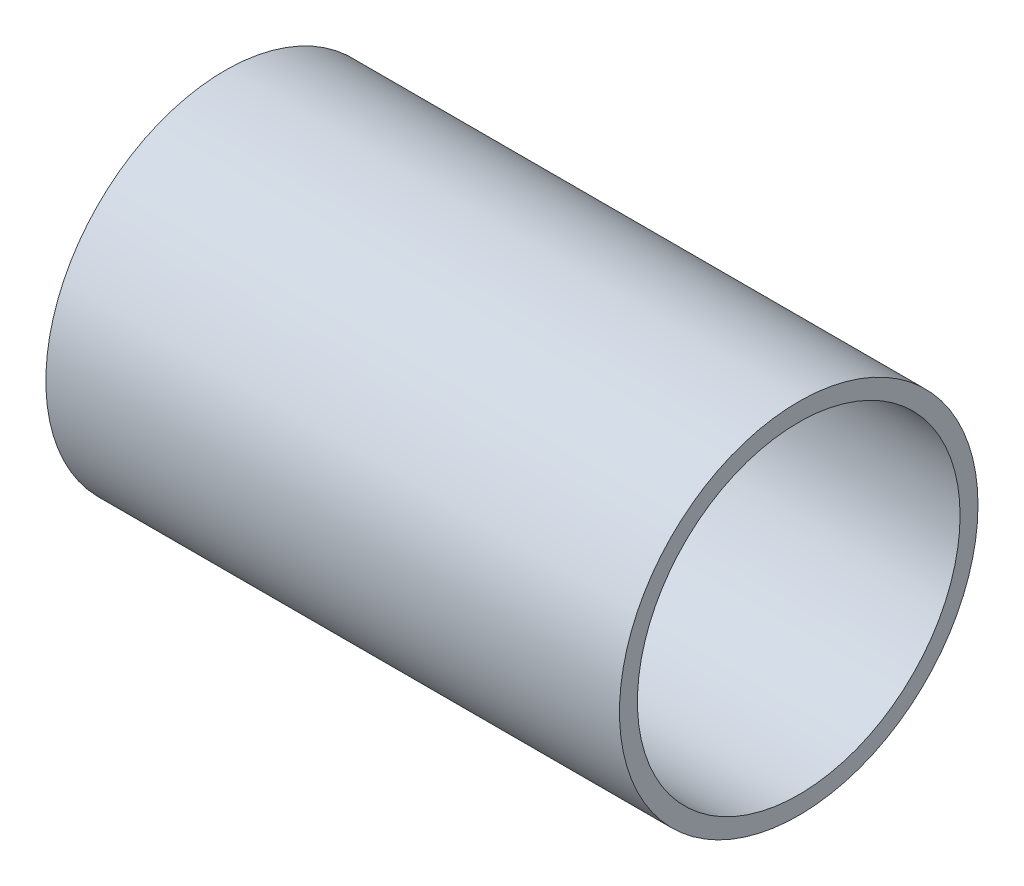
ISO-10303-21;
HEADER;
FILE_DESCRIPTION(('STEP AP214'),'2;1');
FILE_NAME('part.step','',(''),(''),'','','');
FILE_SCHEMA(('AUTOMOTIVE_DESIGN { 1 0 10303 214 1 1 1 1 }'));
ENDSEC;
DATA;
#1=APPLICATION_CONTEXT('core data for automotive mechanical design processes');
#2=APPLICATION_PROTOCOL_DEFINITION('international standard','automotive_design',2000,#1);
#3=PRODUCT_CONTEXT('',#1,'mechanical');
#4=PRODUCT('Part','Part','',(#3));
#5=PRODUCT_RELATED_PRODUCT_CATEGORY('part','',(#4));
#6=PRODUCT_DEFINITION_FORMATION('','',#4);
#7=PRODUCT_DEFINITION_CONTEXT('part definition',#1,'design');
#8=PRODUCT_DEFINITION('design','',#6,#7);
#9=PRODUCT_DEFINITION_SHAPE('','',#8);
#10=(LENGTH_UNIT() NAMED_UNIT(*) SI_UNIT(.MILLI.,.METRE.));
#11=(NAMED_UNIT(*) PLANE_ANGLE_UNIT() SI_UNIT($,.RADIAN.));
#12=(NAMED_UNIT(*) SI_UNIT($,.STERADIAN.) SOLID_ANGLE_UNIT());
#13=UNCERTAINTY_MEASURE_WITH_UNIT(LENGTH_MEASURE(1.E-05),#10,'distance_accuracy_value','');
#14=(GEOMETRIC_REPRESENTATION_CONTEXT(3) GLOBAL_UNCERTAINTY_ASSIGNED_CONTEXT((#13)) GLOBAL_UNIT_ASSIGNED_CONTEXT((#10,
#11,#12)) REPRESENTATION_CONTEXT('',''));
#15=CARTESIAN_POINT('',(0.,0.,0.));
#16=DIRECTION('',(0.,0.,1.));
#17=DIRECTION('',(1.,0.,0.));
#18=AXIS2_PLACEMENT_3D('',#15,#16,#17);
#19=CARTESIAN_POINT('',(25.4,0.,0.));
#20=DIRECTION('',(1.,0.,0.));
#21=DIRECTION('',(0.,0.,-1.));
#22=AXIS2_PLACEMENT_3D('',#19,#20,#21);
#23=PLANE('',#22);
#24=CARTESIAN_POINT('',(25.4,0.,0.));
#25=DIRECTION('',(1.,0.,0.));
#26=DIRECTION('',(0.,0.,-1.));
#27=AXIS2_PLACEMENT_3D('',#24,#25,#26);
#28=CIRCLE('',#27,15.875);
#29=CARTESIAN_POINT('',(25.4,0.,-15.875));
#30=VERTEX_POINT('',#29);
#31=EDGE_CURVE('E10',#30,#30,#28,.T.);
#32=ORIENTED_EDGE('',*,*,#31,.T.);
#33=EDGE_LOOP('',(#32));
#34=FACE_BOUND('',#33,.T.);
#35=CARTESIAN_POINT('',(25.4,0.,0.));
#36=DIRECTION('',(1.,0.,0.));
#37=DIRECTION('',(0.,0.,-1.));
#38=AXIS2_PLACEMENT_3D('',#35,#36,#37);
#39=CIRCLE('',#38,14.2875);
#40=CARTESIAN_POINT('',(25.4,0.,-14.2875));
#41=VERTEX_POINT('',#40);
#42=EDGE_CURVE('E42',#41,#41,#39,.T.);
#43=ORIENTED_EDGE('',*,*,#42,.F.);
#44=EDGE_LOOP('',(#43));
#45=FACE_BOUND('',#44,.T.);
#46=ADVANCED_FACE('F31',(#34,#45),#23,.T.);
#47=CARTESIAN_POINT('',(-25.4,0.,0.));
#48=DIRECTION('',(1.,0.,0.));
#49=DIRECTION('',(0.,0.,-1.));
#50=AXIS2_PLACEMENT_3D('',#47,#48,#49);
#51=PLANE('',#50);
#52=CARTESIAN_POINT('',(-25.4,0.,0.));
#53=DIRECTION('',(1.,0.,0.));
#54=DIRECTION('',(0.,0.,-1.));
#55=AXIS2_PLACEMENT_3D('',#52,#53,#54);
#56=CIRCLE('',#55,15.875);
#57=CARTESIAN_POINT('',(-25.4,0.,-15.875));
#58=VERTEX_POINT('',#57);
#59=EDGE_CURVE('E35',#58,#58,#56,.T.);
#60=ORIENTED_EDGE('',*,*,#59,.F.);
#61=EDGE_LOOP('',(#60));
#62=FACE_BOUND('',#61,.T.);
#63=CARTESIAN_POINT('',(-25.4,0.,0.));
#64=DIRECTION('',(1.,0.,0.));
#65=DIRECTION('',(0.,0.,-1.));
#66=AXIS2_PLACEMENT_3D('',#63,#64,#65);
#67=CIRCLE('',#66,14.2875);
#68=CARTESIAN_POINT('',(-25.4,0.,-14.2875));
#69=VERTEX_POINT('',#68);
#70=EDGE_CURVE('E44',#69,#69,#67,.T.);
#71=ORIENTED_EDGE('',*,*,#70,.T.);
#72=EDGE_LOOP('',(#71));
#73=FACE_BOUND('',#72,.T.);
#74=ADVANCED_FACE('F54',(#62,#73),#51,.F.);
#75=CARTESIAN_POINT('',(25.4,0.,0.));
#76=DIRECTION('',(-1.,0.,0.));
#77=DIRECTION('',(0.,0.,1.));
#78=AXIS2_PLACEMENT_3D('',#75,#76,#77);
#79=CYLINDRICAL_SURFACE('',#78,15.875);
#80=ORIENTED_EDGE('',*,*,#31,.F.);
#81=EDGE_LOOP('',(#80));
#82=FACE_BOUND('',#81,.T.);
#83=ORIENTED_EDGE('',*,*,#59,.T.);
#84=EDGE_LOOP('',(#83));
#85=FACE_BOUND('',#84,.T.);
#86=ADVANCED_FACE('F33',(#82,#85),#79,.T.);
#87=CARTESIAN_POINT('',(25.4,0.,0.));
#88=DIRECTION('',(-1.,0.,0.));
#89=DIRECTION('',(0.,0.,1.));
#90=AXIS2_PLACEMENT_3D('',#87,#88,#89);
#91=CYLINDRICAL_SURFACE('',#90,14.2875);
#92=ORIENTED_EDGE('',*,*,#42,.T.);
#93=EDGE_LOOP('',(#92));
#94=FACE_BOUND('',#93,.T.);
#95=ORIENTED_EDGE('',*,*,#70,.F.);
#96=EDGE_LOOP('',(#95));
#97=FACE_BOUND('',#96,.T.);
#98=ADVANCED_FACE('F50',(#94,#97),#91,.F.);
#99=CLOSED_SHELL('',(#46,#74,#86,#98));
#100=MANIFOLD_SOLID_BREP('B2',#99);
#101=ADVANCED_BREP_SHAPE_REPRESENTATION('',(#18,#100),#14);
#102=SHAPE_DEFINITION_REPRESENTATION(#9,#101);
ENDSEC;
END-ISO-10303-21;
